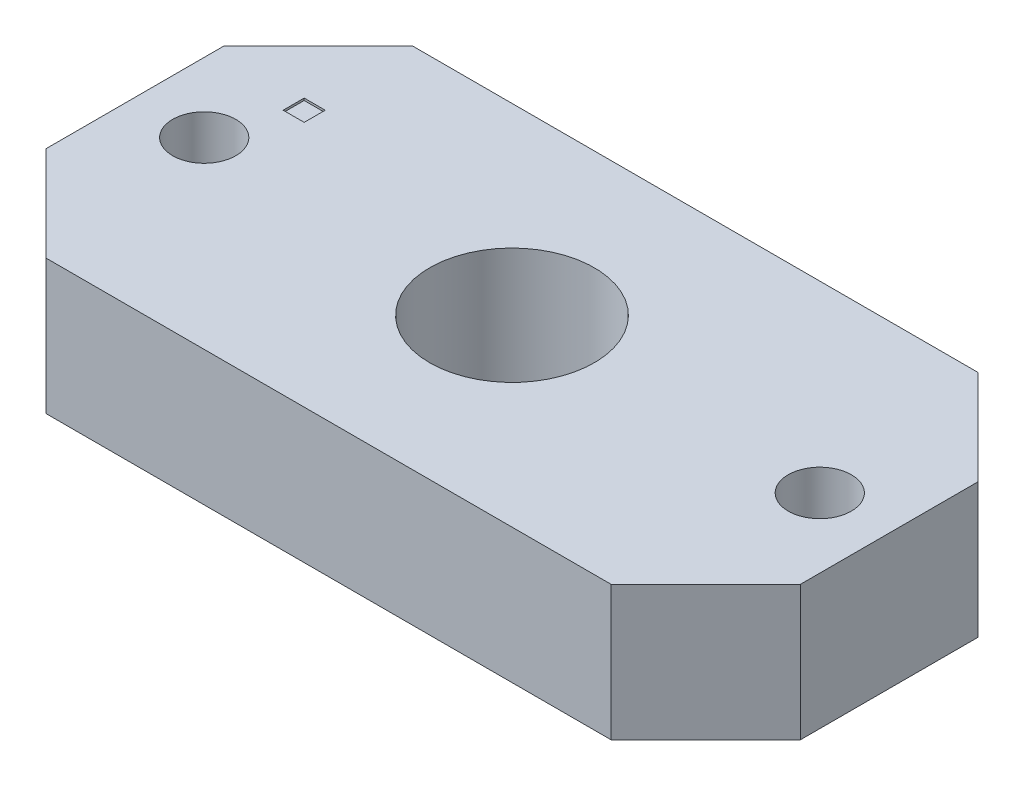
ISO-10303-21;
HEADER;
FILE_DESCRIPTION(('STEP AP214'),'2;1');
FILE_NAME('part.step','',(''),(''),'','','');
FILE_SCHEMA(('AUTOMOTIVE_DESIGN { 1 0 10303 214 1 1 1 1 }'));
ENDSEC;
DATA;
#1=APPLICATION_CONTEXT('core data for automotive mechanical design processes');
#2=APPLICATION_PROTOCOL_DEFINITION('international standard','automotive_design',2000,#1);
#3=PRODUCT_CONTEXT('',#1,'mechanical');
#4=PRODUCT('Part','Part','',(#3));
#5=PRODUCT_RELATED_PRODUCT_CATEGORY('part','',(#4));
#6=PRODUCT_DEFINITION_FORMATION('','',#4);
#7=PRODUCT_DEFINITION_CONTEXT('part definition',#1,'design');
#8=PRODUCT_DEFINITION('design','',#6,#7);
#9=PRODUCT_DEFINITION_SHAPE('','',#8);
#10=(LENGTH_UNIT() NAMED_UNIT(*) SI_UNIT(.MILLI.,.METRE.));
#11=(NAMED_UNIT(*) PLANE_ANGLE_UNIT() SI_UNIT($,.RADIAN.));
#12=(NAMED_UNIT(*) SI_UNIT($,.STERADIAN.) SOLID_ANGLE_UNIT());
#13=UNCERTAINTY_MEASURE_WITH_UNIT(LENGTH_MEASURE(1.E-05),#10,'distance_accuracy_value','');
#14=(GEOMETRIC_REPRESENTATION_CONTEXT(3) GLOBAL_UNCERTAINTY_ASSIGNED_CONTEXT((#13)) GLOBAL_UNIT_ASSIGNED_CONTEXT((#10,
#11,#12)) REPRESENTATION_CONTEXT('',''));
#15=CARTESIAN_POINT('',(0.,0.,0.));
#16=DIRECTION('',(0.,0.,1.));
#17=DIRECTION('',(1.,0.,0.));
#18=AXIS2_PLACEMENT_3D('',#15,#16,#17);
#19=CARTESIAN_POINT('',(106.99610131961,6.4,-15.883489834479));
#20=DIRECTION('',(0.,1.,0.));
#21=DIRECTION('',(0.,0.,1.));
#22=AXIS2_PLACEMENT_3D('',#19,#20,#21);
#23=PLANE('',#22);
#24=DIRECTION('',(0.,0.,-1.));
#25=VECTOR('',#24,1.);
#26=CARTESIAN_POINT('',(76.1960237212015,6.4,-10.1650905944788));
#27=LINE('',#26,#25);
#28=CARTESIAN_POINT('',(76.1960237212015,6.4,-10.1650905944788));
#29=VERTEX_POINT('',#28);
#30=CARTESIAN_POINT('',(76.1960237212015,6.4,-11.1650905944788));
#31=VERTEX_POINT('',#30);
#32=EDGE_CURVE('E47',#29,#31,#27,.T.);
#33=ORIENTED_EDGE('',*,*,#32,.F.);
#34=DIRECTION('',(1.,0.,0.));
#35=VECTOR('',#34,1.);
#36=CARTESIAN_POINT('',(75.1960237212015,6.4,-10.1650905944788));
#37=LINE('',#36,#35);
#38=CARTESIAN_POINT('',(75.1960237212015,6.4,-10.1650905944788));
#39=VERTEX_POINT('',#38);
#40=EDGE_CURVE('E219',#39,#29,#37,.T.);
#41=ORIENTED_EDGE('',*,*,#40,.F.);
#42=DIRECTION('',(0.,0.,1.));
#43=VECTOR('',#42,1.);
#44=CARTESIAN_POINT('',(75.1960237212015,6.4,-10.1650905944788));
#45=LINE('',#44,#43);
#46=CARTESIAN_POINT('',(75.1960237212015,6.4,-11.1650905944788));
#47=VERTEX_POINT('',#46);
#48=EDGE_CURVE('E223',#47,#39,#45,.T.);
#49=ORIENTED_EDGE('',*,*,#48,.F.);
#50=DIRECTION('',(-1.,0.,0.));
#51=VECTOR('',#50,1.);
#52=CARTESIAN_POINT('',(76.1960237212015,6.4,-11.1650905944788));
#53=LINE('',#52,#51);
#54=EDGE_CURVE('E226',#31,#47,#53,.T.);
#55=ORIENTED_EDGE('',*,*,#54,.F.);
#56=EDGE_LOOP('',(#33,#41,#49,#55));
#57=FACE_BOUND('',#56,.T.);
#58=CARTESIAN_POINT('',(74.4461013196099,6.4,-7.16509059447879));
#59=DIRECTION('',(0.,1.,0.));
#60=DIRECTION('',(0.,0.,1.));
#61=AXIS2_PLACEMENT_3D('',#58,#59,#60);
#62=CIRCLE('',#61,1.5);
#63=CARTESIAN_POINT('',(74.4461013196099,6.4,-5.66509059447879));
#64=VERTEX_POINT('',#63);
#65=EDGE_CURVE('E194',#64,#64,#62,.T.);
#66=ORIENTED_EDGE('',*,*,#65,.F.);
#67=EDGE_LOOP('',(#66));
#68=FACE_BOUND('',#67,.T.);
#69=DIRECTION('',(0.,0.,-1.));
#70=VECTOR('',#69,1.);
#71=CARTESIAN_POINT('',(106.99610131961,6.4,-2.94669135447867));
#72=LINE('',#71,#70);
#73=CARTESIAN_POINT('',(106.99610131961,6.4,-2.94669135447867));
#74=VERTEX_POINT('',#73);
#75=CARTESIAN_POINT('',(106.99610131961,6.4,-11.3834898344789));
#76=VERTEX_POINT('',#75);
#77=EDGE_CURVE('E157',#74,#76,#72,.T.);
#78=ORIENTED_EDGE('',*,*,#77,.T.);
#79=DIRECTION('',(-0.707106781186541,0.,-0.707106781186554));
#80=VECTOR('',#79,1.);
#81=CARTESIAN_POINT('',(102.49610131961,6.4,-15.8834898344789));
#82=LINE('',#81,#80);
#83=CARTESIAN_POINT('',(102.49610131961,6.4,-15.8834898344789));
#84=VERTEX_POINT('',#83);
#85=EDGE_CURVE('E97',#76,#84,#82,.T.);
#86=ORIENTED_EDGE('',*,*,#85,.T.);
#87=DIRECTION('',(-1.,0.,0.));
#88=VECTOR('',#87,1.);
#89=CARTESIAN_POINT('',(102.49610131961,6.4,-15.8834898344789));
#90=LINE('',#89,#88);
#91=CARTESIAN_POINT('',(75.6461013196099,6.4,-15.8834898344788));
#92=VERTEX_POINT('',#91);
#93=EDGE_CURVE('E172',#84,#92,#90,.T.);
#94=ORIENTED_EDGE('',*,*,#93,.T.);
#95=DIRECTION('',(-0.707106781186544,0.,0.707106781186551));
#96=VECTOR('',#95,1.);
#97=CARTESIAN_POINT('',(75.6461013196099,6.4,-15.8834898344788));
#98=LINE('',#97,#96);
#99=CARTESIAN_POINT('',(71.1461013196099,6.4,-11.3834898344788));
#100=VERTEX_POINT('',#99);
#101=EDGE_CURVE('E185',#92,#100,#98,.T.);
#102=ORIENTED_EDGE('',*,*,#101,.T.);
#103=DIRECTION('',(0.,0.,1.));
#104=VECTOR('',#103,1.);
#105=CARTESIAN_POINT('',(71.1461013196099,6.4,-2.94669135447882));
#106=LINE('',#105,#104);
#107=CARTESIAN_POINT('',(71.1461013196099,6.4,-2.94669135447882));
#108=VERTEX_POINT('',#107);
#109=EDGE_CURVE('E120',#100,#108,#106,.T.);
#110=ORIENTED_EDGE('',*,*,#109,.T.);
#111=DIRECTION('',(0.707106781186548,0.,0.707106781186548));
#112=VECTOR('',#111,1.);
#113=CARTESIAN_POINT('',(75.6461013196099,6.4,1.55330864552121));
#114=LINE('',#113,#112);
#115=CARTESIAN_POINT('',(75.6461013196099,6.4,1.55330864552121));
#116=VERTEX_POINT('',#115);
#117=EDGE_CURVE('E113',#108,#116,#114,.T.);
#118=ORIENTED_EDGE('',*,*,#117,.T.);
#119=DIRECTION('',(1.,0.,0.));
#120=VECTOR('',#119,1.);
#121=CARTESIAN_POINT('',(102.49610131961,6.4,1.55330864552121));
#122=LINE('',#121,#120);
#123=CARTESIAN_POINT('',(102.49610131961,6.4,1.55330864552121));
#124=VERTEX_POINT('',#123);
#125=EDGE_CURVE('E117',#116,#124,#122,.T.);
#126=ORIENTED_EDGE('',*,*,#125,.T.);
#127=DIRECTION('',(0.707106781186547,0.,-0.707106781186547));
#128=VECTOR('',#127,1.);
#129=CARTESIAN_POINT('',(102.49610131961,6.4,1.55330864552121));
#130=LINE('',#129,#128);
#131=EDGE_CURVE('E56',#124,#74,#130,.T.);
#132=ORIENTED_EDGE('',*,*,#131,.T.);
#133=EDGE_LOOP('',(#78,#86,#94,#102,#110,#118,#126,#132));
#134=FACE_BOUND('',#133,.T.);
#135=CARTESIAN_POINT('',(89.0711013196099,6.4,-7.16509059447879));
#136=DIRECTION('',(0.,1.,0.));
#137=DIRECTION('',(0.,0.,1.));
#138=AXIS2_PLACEMENT_3D('',#135,#136,#137);
#139=CIRCLE('',#138,3.9125);
#140=CARTESIAN_POINT('',(89.0711013196099,6.4,-3.25259059447878));
#141=VERTEX_POINT('',#140);
#142=EDGE_CURVE('E145',#141,#141,#139,.T.);
#143=ORIENTED_EDGE('',*,*,#142,.F.);
#144=EDGE_LOOP('',(#143));
#145=FACE_BOUND('',#144,.T.);
#146=CARTESIAN_POINT('',(103.69610131961,6.4,-7.16509059447886));
#147=DIRECTION('',(0.,1.,0.));
#148=DIRECTION('',(0.,0.,-1.));
#149=AXIS2_PLACEMENT_3D('',#146,#147,#148);
#150=CIRCLE('',#149,1.5);
#151=CARTESIAN_POINT('',(103.69610131961,6.4,-8.66509059447886));
#152=VERTEX_POINT('',#151);
#153=EDGE_CURVE('E200',#152,#152,#150,.T.);
#154=ORIENTED_EDGE('',*,*,#153,.F.);
#155=EDGE_LOOP('',(#154));
#156=FACE_BOUND('',#155,.T.);
#157=ADVANCED_FACE('F32',(#57,#68,#134,#145,#156),#23,.T.);
#158=CARTESIAN_POINT('',(106.99610131961,0.,-15.883489834479));
#159=DIRECTION('',(0.,1.,0.));
#160=DIRECTION('',(0.,0.,1.));
#161=AXIS2_PLACEMENT_3D('',#158,#159,#160);
#162=PLANE('',#161);
#163=CARTESIAN_POINT('',(74.4461013196099,0.,-7.16509059447879));
#164=DIRECTION('',(0.,1.,0.));
#165=DIRECTION('',(0.,0.,1.));
#166=AXIS2_PLACEMENT_3D('',#163,#164,#165);
#167=CIRCLE('',#166,1.5);
#168=CARTESIAN_POINT('',(74.4461013196099,0.,-5.66509059447879));
#169=VERTEX_POINT('',#168);
#170=EDGE_CURVE('E197',#169,#169,#167,.T.);
#171=ORIENTED_EDGE('',*,*,#170,.T.);
#172=EDGE_LOOP('',(#171));
#173=FACE_BOUND('',#172,.T.);
#174=DIRECTION('',(0.,0.,-1.));
#175=VECTOR('',#174,1.);
#176=CARTESIAN_POINT('',(106.99610131961,0.,-2.94669135447867));
#177=LINE('',#176,#175);
#178=CARTESIAN_POINT('',(106.99610131961,0.,-2.94669135447867));
#179=VERTEX_POINT('',#178);
#180=CARTESIAN_POINT('',(106.99610131961,0.,-11.3834898344789));
#181=VERTEX_POINT('',#180);
#182=EDGE_CURVE('E141',#179,#181,#177,.T.);
#183=ORIENTED_EDGE('',*,*,#182,.F.);
#184=DIRECTION('',(0.707106781186547,0.,-0.707106781186547));
#185=VECTOR('',#184,1.);
#186=CARTESIAN_POINT('',(102.49610131961,0.,1.55330864552121));
#187=LINE('',#186,#185);
#188=CARTESIAN_POINT('',(102.49610131961,0.,1.55330864552121));
#189=VERTEX_POINT('',#188);
#190=EDGE_CURVE('E89',#189,#179,#187,.T.);
#191=ORIENTED_EDGE('',*,*,#190,.F.);
#192=DIRECTION('',(1.,0.,0.));
#193=VECTOR('',#192,1.);
#194=CARTESIAN_POINT('',(102.49610131961,0.,1.55330864552121));
#195=LINE('',#194,#193);
#196=CARTESIAN_POINT('',(75.6461013196099,0.,1.55330864552121));
#197=VERTEX_POINT('',#196);
#198=EDGE_CURVE('E154',#197,#189,#195,.T.);
#199=ORIENTED_EDGE('',*,*,#198,.F.);
#200=DIRECTION('',(0.707106781186548,0.,0.707106781186548));
#201=VECTOR('',#200,1.);
#202=CARTESIAN_POINT('',(75.6461013196099,0.,1.55330864552121));
#203=LINE('',#202,#201);
#204=CARTESIAN_POINT('',(71.1461013196099,0.,-2.94669135447882));
#205=VERTEX_POINT('',#204);
#206=EDGE_CURVE('E129',#205,#197,#203,.T.);
#207=ORIENTED_EDGE('',*,*,#206,.F.);
#208=DIRECTION('',(0.,0.,1.));
#209=VECTOR('',#208,1.);
#210=CARTESIAN_POINT('',(71.1461013196099,0.,-2.94669135447882));
#211=LINE('',#210,#209);
#212=CARTESIAN_POINT('',(71.1461013196099,0.,-11.3834898344788));
#213=VERTEX_POINT('',#212);
#214=EDGE_CURVE('E151',#213,#205,#211,.T.);
#215=ORIENTED_EDGE('',*,*,#214,.F.);
#216=DIRECTION('',(-0.707106781186544,0.,0.707106781186551));
#217=VECTOR('',#216,1.);
#218=CARTESIAN_POINT('',(75.6461013196099,0.,-15.8834898344788));
#219=LINE('',#218,#217);
#220=CARTESIAN_POINT('',(75.6461013196099,0.,-15.8834898344788));
#221=VERTEX_POINT('',#220);
#222=EDGE_CURVE('E149',#221,#213,#219,.T.);
#223=ORIENTED_EDGE('',*,*,#222,.F.);
#224=DIRECTION('',(-1.,0.,0.));
#225=VECTOR('',#224,1.);
#226=CARTESIAN_POINT('',(102.49610131961,0.,-15.8834898344789));
#227=LINE('',#226,#225);
#228=CARTESIAN_POINT('',(102.49610131961,0.,-15.8834898344789));
#229=VERTEX_POINT('',#228);
#230=EDGE_CURVE('E147',#229,#221,#227,.T.);
#231=ORIENTED_EDGE('',*,*,#230,.F.);
#232=DIRECTION('',(-0.707106781186541,0.,-0.707106781186554));
#233=VECTOR('',#232,1.);
#234=CARTESIAN_POINT('',(102.49610131961,0.,-15.8834898344789));
#235=LINE('',#234,#233);
#236=EDGE_CURVE('E144',#181,#229,#235,.T.);
#237=ORIENTED_EDGE('',*,*,#236,.F.);
#238=EDGE_LOOP('',(#183,#191,#199,#207,#215,#223,#231,#237));
#239=FACE_BOUND('',#238,.T.);
#240=CARTESIAN_POINT('',(89.0711013196099,0.,-7.16509059447879));
#241=DIRECTION('',(0.,1.,0.));
#242=DIRECTION('',(0.,0.,1.));
#243=AXIS2_PLACEMENT_3D('',#240,#241,#242);
#244=CIRCLE('',#243,3.9125);
#245=CARTESIAN_POINT('',(89.0711013196099,0.,-3.25259059447878));
#246=VERTEX_POINT('',#245);
#247=EDGE_CURVE('E191',#246,#246,#244,.T.);
#248=ORIENTED_EDGE('',*,*,#247,.T.);
#249=EDGE_LOOP('',(#248));
#250=FACE_BOUND('',#249,.T.);
#251=CARTESIAN_POINT('',(103.69610131961,0.,-7.16509059447886));
#252=DIRECTION('',(0.,1.,0.));
#253=DIRECTION('',(0.,0.,-1.));
#254=AXIS2_PLACEMENT_3D('',#251,#252,#253);
#255=CIRCLE('',#254,1.5);
#256=CARTESIAN_POINT('',(103.69610131961,0.,-8.66509059447886));
#257=VERTEX_POINT('',#256);
#258=EDGE_CURVE('E203',#257,#257,#255,.T.);
#259=ORIENTED_EDGE('',*,*,#258,.T.);
#260=EDGE_LOOP('',(#259));
#261=FACE_BOUND('',#260,.T.);
#262=ADVANCED_FACE('F176',(#173,#239,#250,#261),#162,.F.);
#263=CARTESIAN_POINT('',(106.99610131961,6.4,-2.94669135447867));
#264=DIRECTION('',(-1.,0.,0.));
#265=DIRECTION('',(0.,0.,1.));
#266=AXIS2_PLACEMENT_3D('',#263,#264,#265);
#267=PLANE('',#266);
#268=ORIENTED_EDGE('',*,*,#182,.T.);
#269=DIRECTION('',(0.,-1.,0.));
#270=VECTOR('',#269,1.);
#271=CARTESIAN_POINT('',(106.99610131961,6.4,-11.3834898344789));
#272=LINE('',#271,#270);
#273=EDGE_CURVE('E11',#76,#181,#272,.T.);
#274=ORIENTED_EDGE('',*,*,#273,.F.);
#275=ORIENTED_EDGE('',*,*,#77,.F.);
#276=DIRECTION('',(0.,-1.,0.));
#277=VECTOR('',#276,1.);
#278=CARTESIAN_POINT('',(106.99610131961,6.4,-2.94669135447867));
#279=LINE('',#278,#277);
#280=EDGE_CURVE('E137',#74,#179,#279,.T.);
#281=ORIENTED_EDGE('',*,*,#280,.T.);
#282=EDGE_LOOP('',(#268,#274,#275,#281));
#283=FACE_BOUND('',#282,.T.);
#284=ADVANCED_FACE('F34',(#283),#267,.F.);
#285=CARTESIAN_POINT('',(102.49610131961,6.4,-15.8834898344789));
#286=DIRECTION('',(-0.707106781186554,0.,0.707106781186541));
#287=DIRECTION('',(0.707106781186541,0.,0.707106781186554));
#288=AXIS2_PLACEMENT_3D('',#285,#286,#287);
#289=PLANE('',#288);
#290=ORIENTED_EDGE('',*,*,#236,.T.);
#291=DIRECTION('',(0.,-1.,0.));
#292=VECTOR('',#291,1.);
#293=CARTESIAN_POINT('',(102.49610131961,6.4,-15.8834898344789));
#294=LINE('',#293,#292);
#295=EDGE_CURVE('E40',#84,#229,#294,.T.);
#296=ORIENTED_EDGE('',*,*,#295,.F.);
#297=ORIENTED_EDGE('',*,*,#85,.F.);
#298=ORIENTED_EDGE('',*,*,#273,.T.);
#299=EDGE_LOOP('',(#290,#296,#297,#298));
#300=FACE_BOUND('',#299,.T.);
#301=ADVANCED_FACE('F302',(#300),#289,.F.);
#302=CARTESIAN_POINT('',(102.49610131961,6.4,-15.8834898344789));
#303=DIRECTION('',(0.,0.,1.));
#304=DIRECTION('',(1.,0.,0.));
#305=AXIS2_PLACEMENT_3D('',#302,#303,#304);
#306=PLANE('',#305);
#307=ORIENTED_EDGE('',*,*,#230,.T.);
#308=DIRECTION('',(0.,-1.,0.));
#309=VECTOR('',#308,1.);
#310=CARTESIAN_POINT('',(75.6461013196099,6.4,-15.8834898344788));
#311=LINE('',#310,#309);
#312=EDGE_CURVE('E164',#92,#221,#311,.T.);
#313=ORIENTED_EDGE('',*,*,#312,.F.);
#314=ORIENTED_EDGE('',*,*,#93,.F.);
#315=ORIENTED_EDGE('',*,*,#295,.T.);
#316=EDGE_LOOP('',(#307,#313,#314,#315));
#317=FACE_BOUND('',#316,.T.);
#318=ADVANCED_FACE('F170',(#317),#306,.F.);
#319=CARTESIAN_POINT('',(75.6461013196099,6.4,-15.8834898344788));
#320=DIRECTION('',(0.707106781186551,0.,0.707106781186544));
#321=DIRECTION('',(0.707106781186544,0.,-0.707106781186551));
#322=AXIS2_PLACEMENT_3D('',#319,#320,#321);
#323=PLANE('',#322);
#324=ORIENTED_EDGE('',*,*,#222,.T.);
#325=DIRECTION('',(0.,-1.,0.));
#326=VECTOR('',#325,1.);
#327=CARTESIAN_POINT('',(71.1461013196099,6.4,-11.3834898344788));
#328=LINE('',#327,#326);
#329=EDGE_CURVE('E161',#100,#213,#328,.T.);
#330=ORIENTED_EDGE('',*,*,#329,.F.);
#331=ORIENTED_EDGE('',*,*,#101,.F.);
#332=ORIENTED_EDGE('',*,*,#312,.T.);
#333=EDGE_LOOP('',(#324,#330,#331,#332));
#334=FACE_BOUND('',#333,.T.);
#335=ADVANCED_FACE('F181',(#334),#323,.F.);
#336=CARTESIAN_POINT('',(71.1461013196099,6.4,-2.94669135447882));
#337=DIRECTION('',(1.,0.,0.));
#338=DIRECTION('',(0.,0.,-1.));
#339=AXIS2_PLACEMENT_3D('',#336,#337,#338);
#340=PLANE('',#339);
#341=ORIENTED_EDGE('',*,*,#214,.T.);
#342=DIRECTION('',(0.,-1.,0.));
#343=VECTOR('',#342,1.);
#344=CARTESIAN_POINT('',(71.1461013196099,6.4,-2.94669135447882));
#345=LINE('',#344,#343);
#346=EDGE_CURVE('E132',#108,#205,#345,.T.);
#347=ORIENTED_EDGE('',*,*,#346,.F.);
#348=ORIENTED_EDGE('',*,*,#109,.F.);
#349=ORIENTED_EDGE('',*,*,#329,.T.);
#350=EDGE_LOOP('',(#341,#347,#348,#349));
#351=FACE_BOUND('',#350,.T.);
#352=ADVANCED_FACE('F184',(#351),#340,.F.);
#353=CARTESIAN_POINT('',(75.6461013196099,6.4,1.55330864552121));
#354=DIRECTION('',(0.707106781186548,0.,-0.707106781186548));
#355=DIRECTION('',(-0.707106781186548,0.,-0.707106781186548));
#356=AXIS2_PLACEMENT_3D('',#353,#354,#355);
#357=PLANE('',#356);
#358=ORIENTED_EDGE('',*,*,#206,.T.);
#359=DIRECTION('',(0.,-1.,0.));
#360=VECTOR('',#359,1.);
#361=CARTESIAN_POINT('',(75.6461013196099,6.4,1.55330864552121));
#362=LINE('',#361,#360);
#363=EDGE_CURVE('E126',#116,#197,#362,.T.);
#364=ORIENTED_EDGE('',*,*,#363,.F.);
#365=ORIENTED_EDGE('',*,*,#117,.F.);
#366=ORIENTED_EDGE('',*,*,#346,.T.);
#367=EDGE_LOOP('',(#358,#364,#365,#366));
#368=FACE_BOUND('',#367,.T.);
#369=ADVANCED_FACE('F127',(#368),#357,.F.);
#370=CARTESIAN_POINT('',(102.49610131961,6.4,1.55330864552121));
#371=DIRECTION('',(0.,0.,-1.));
#372=DIRECTION('',(-1.,0.,0.));
#373=AXIS2_PLACEMENT_3D('',#370,#371,#372);
#374=PLANE('',#373);
#375=ORIENTED_EDGE('',*,*,#198,.T.);
#376=DIRECTION('',(0.,-1.,0.));
#377=VECTOR('',#376,1.);
#378=CARTESIAN_POINT('',(102.49610131961,6.4,1.55330864552121));
#379=LINE('',#378,#377);
#380=EDGE_CURVE('E133',#124,#189,#379,.T.);
#381=ORIENTED_EDGE('',*,*,#380,.F.);
#382=ORIENTED_EDGE('',*,*,#125,.F.);
#383=ORIENTED_EDGE('',*,*,#363,.T.);
#384=EDGE_LOOP('',(#375,#381,#382,#383));
#385=FACE_BOUND('',#384,.T.);
#386=ADVANCED_FACE('F135',(#385),#374,.F.);
#387=CARTESIAN_POINT('',(102.49610131961,6.4,1.55330864552121));
#388=DIRECTION('',(-0.707106781186548,0.,-0.707106781186547));
#389=DIRECTION('',(-0.707106781186547,0.,0.707106781186548));
#390=AXIS2_PLACEMENT_3D('',#387,#388,#389);
#391=PLANE('',#390);
#392=ORIENTED_EDGE('',*,*,#190,.T.);
#393=ORIENTED_EDGE('',*,*,#280,.F.);
#394=ORIENTED_EDGE('',*,*,#131,.F.);
#395=ORIENTED_EDGE('',*,*,#380,.T.);
#396=EDGE_LOOP('',(#392,#393,#394,#395));
#397=FACE_BOUND('',#396,.T.);
#398=ADVANCED_FACE('F290',(#397),#391,.F.);
#399=CARTESIAN_POINT('',(89.0711013196099,6.4,-7.16509059447879));
#400=DIRECTION('',(0.,-1.,0.));
#401=DIRECTION('',(0.,0.,-1.));
#402=AXIS2_PLACEMENT_3D('',#399,#400,#401);
#403=CYLINDRICAL_SURFACE('',#402,3.9125);
#404=ORIENTED_EDGE('',*,*,#142,.T.);
#405=EDGE_LOOP('',(#404));
#406=FACE_BOUND('',#405,.T.);
#407=ORIENTED_EDGE('',*,*,#247,.F.);
#408=EDGE_LOOP('',(#407));
#409=FACE_BOUND('',#408,.T.);
#410=ADVANCED_FACE('F287',(#406,#409),#403,.F.);
#411=CARTESIAN_POINT('',(74.4461013196099,6.4,-7.16509059447879));
#412=DIRECTION('',(0.,-1.,0.));
#413=DIRECTION('',(0.,0.,-1.));
#414=AXIS2_PLACEMENT_3D('',#411,#412,#413);
#415=CYLINDRICAL_SURFACE('',#414,1.5);
#416=ORIENTED_EDGE('',*,*,#65,.T.);
#417=EDGE_LOOP('',(#416));
#418=FACE_BOUND('',#417,.T.);
#419=ORIENTED_EDGE('',*,*,#170,.F.);
#420=EDGE_LOOP('',(#419));
#421=FACE_BOUND('',#420,.T.);
#422=ADVANCED_FACE('F365',(#418,#421),#415,.F.);
#423=CARTESIAN_POINT('',(103.69610131961,6.4,-7.16509059447886));
#424=DIRECTION('',(0.,-1.,0.));
#425=DIRECTION('',(0.,0.,-1.));
#426=AXIS2_PLACEMENT_3D('',#423,#424,#425);
#427=CYLINDRICAL_SURFACE('',#426,1.5);
#428=ORIENTED_EDGE('',*,*,#153,.T.);
#429=EDGE_LOOP('',(#428));
#430=FACE_BOUND('',#429,.T.);
#431=ORIENTED_EDGE('',*,*,#258,.F.);
#432=EDGE_LOOP('',(#431));
#433=FACE_BOUND('',#432,.T.);
#434=ADVANCED_FACE('F373',(#430,#433),#427,.F.);
#435=CARTESIAN_POINT('',(76.1960237212015,6.3,-10.1650905944788));
#436=DIRECTION('',(1.,0.,0.));
#437=DIRECTION('',(0.,0.,-1.));
#438=AXIS2_PLACEMENT_3D('',#435,#436,#437);
#439=PLANE('',#438);
#440=ORIENTED_EDGE('',*,*,#32,.T.);
#441=DIRECTION('',(0.,1.,0.));
#442=VECTOR('',#441,1.);
#443=CARTESIAN_POINT('',(76.1960237212015,6.3,-11.1650905944788));
#444=LINE('',#443,#442);
#445=CARTESIAN_POINT('',(76.1960237212015,6.3,-11.1650905944788));
#446=VERTEX_POINT('',#445);
#447=EDGE_CURVE('E209',#446,#31,#444,.T.);
#448=ORIENTED_EDGE('',*,*,#447,.F.);
#449=DIRECTION('',(0.,0.,-1.));
#450=VECTOR('',#449,1.);
#451=CARTESIAN_POINT('',(76.1960237212015,6.3,-10.1650905944788));
#452=LINE('',#451,#450);
#453=CARTESIAN_POINT('',(76.1960237212015,6.3,-10.1650905944788));
#454=VERTEX_POINT('',#453);
#455=EDGE_CURVE('E222',#454,#446,#452,.T.);
#456=ORIENTED_EDGE('',*,*,#455,.F.);
#457=DIRECTION('',(0.,1.,0.));
#458=VECTOR('',#457,1.);
#459=CARTESIAN_POINT('',(76.1960237212015,6.3,-10.1650905944788));
#460=LINE('',#459,#458);
#461=EDGE_CURVE('E206',#454,#29,#460,.T.);
#462=ORIENTED_EDGE('',*,*,#461,.T.);
#463=EDGE_LOOP('',(#440,#448,#456,#462));
#464=FACE_BOUND('',#463,.T.);
#465=ADVANCED_FACE('F247',(#464),#439,.F.);
#466=CARTESIAN_POINT('',(75.1960237212015,6.3,-10.1650905944788));
#467=DIRECTION('',(0.,0.,1.));
#468=DIRECTION('',(1.,0.,0.));
#469=AXIS2_PLACEMENT_3D('',#466,#467,#468);
#470=PLANE('',#469);
#471=ORIENTED_EDGE('',*,*,#40,.T.);
#472=ORIENTED_EDGE('',*,*,#461,.F.);
#473=DIRECTION('',(1.,0.,0.));
#474=VECTOR('',#473,1.);
#475=CARTESIAN_POINT('',(75.1960237212015,6.3,-10.1650905944788));
#476=LINE('',#475,#474);
#477=CARTESIAN_POINT('',(75.1960237212015,6.3,-10.1650905944788));
#478=VERTEX_POINT('',#477);
#479=EDGE_CURVE('E212',#478,#454,#476,.T.);
#480=ORIENTED_EDGE('',*,*,#479,.F.);
#481=DIRECTION('',(0.,1.,0.));
#482=VECTOR('',#481,1.);
#483=CARTESIAN_POINT('',(75.1960237212015,6.3,-10.1650905944788));
#484=LINE('',#483,#482);
#485=EDGE_CURVE('E215',#478,#39,#484,.T.);
#486=ORIENTED_EDGE('',*,*,#485,.T.);
#487=EDGE_LOOP('',(#471,#472,#480,#486));
#488=FACE_BOUND('',#487,.T.);
#489=ADVANCED_FACE('F258',(#488),#470,.F.);
#490=CARTESIAN_POINT('',(75.1960237212015,6.3,-10.1650905944788));
#491=DIRECTION('',(-1.,0.,0.));
#492=DIRECTION('',(0.,0.,1.));
#493=AXIS2_PLACEMENT_3D('',#490,#491,#492);
#494=PLANE('',#493);
#495=ORIENTED_EDGE('',*,*,#48,.T.);
#496=ORIENTED_EDGE('',*,*,#485,.F.);
#497=DIRECTION('',(0.,0.,1.));
#498=VECTOR('',#497,1.);
#499=CARTESIAN_POINT('',(75.1960237212015,6.3,-10.1650905944788));
#500=LINE('',#499,#498);
#501=CARTESIAN_POINT('',(75.1960237212015,6.3,-11.1650905944788));
#502=VERTEX_POINT('',#501);
#503=EDGE_CURVE('E232',#502,#478,#500,.T.);
#504=ORIENTED_EDGE('',*,*,#503,.F.);
#505=DIRECTION('',(0.,1.,0.));
#506=VECTOR('',#505,1.);
#507=CARTESIAN_POINT('',(75.1960237212015,6.3,-11.1650905944788));
#508=LINE('',#507,#506);
#509=EDGE_CURVE('E211',#502,#47,#508,.T.);
#510=ORIENTED_EDGE('',*,*,#509,.T.);
#511=EDGE_LOOP('',(#495,#496,#504,#510));
#512=FACE_BOUND('',#511,.T.);
#513=ADVANCED_FACE('F263',(#512),#494,.F.);
#514=CARTESIAN_POINT('',(76.1960237212015,6.3,-11.1650905944788));
#515=DIRECTION('',(0.,0.,-1.));
#516=DIRECTION('',(-1.,0.,0.));
#517=AXIS2_PLACEMENT_3D('',#514,#515,#516);
#518=PLANE('',#517);
#519=ORIENTED_EDGE('',*,*,#54,.T.);
#520=ORIENTED_EDGE('',*,*,#509,.F.);
#521=DIRECTION('',(-1.,0.,0.));
#522=VECTOR('',#521,1.);
#523=CARTESIAN_POINT('',(76.1960237212015,6.3,-11.1650905944788));
#524=LINE('',#523,#522);
#525=EDGE_CURVE('E235',#446,#502,#524,.T.);
#526=ORIENTED_EDGE('',*,*,#525,.F.);
#527=ORIENTED_EDGE('',*,*,#447,.T.);
#528=EDGE_LOOP('',(#519,#520,#526,#527));
#529=FACE_BOUND('',#528,.T.);
#530=ADVANCED_FACE('F269',(#529),#518,.F.);
#531=CARTESIAN_POINT('',(76.1960237212015,6.3,-11.1650905944788));
#532=DIRECTION('',(0.,1.,0.));
#533=DIRECTION('',(0.,0.,1.));
#534=AXIS2_PLACEMENT_3D('',#531,#532,#533);
#535=PLANE('',#534);
#536=ORIENTED_EDGE('',*,*,#455,.T.);
#537=ORIENTED_EDGE('',*,*,#525,.T.);
#538=ORIENTED_EDGE('',*,*,#503,.T.);
#539=ORIENTED_EDGE('',*,*,#479,.T.);
#540=EDGE_LOOP('',(#536,#537,#538,#539));
#541=FACE_BOUND('',#540,.T.);
#542=ADVANCED_FACE('F242',(#541),#535,.T.);
#543=CLOSED_SHELL('',(#157,#262,#284,#301,#318,#335,#352,#369,#386,#398,#410,#422,#434,#465,
#489,#513,#530,#542));
#544=MANIFOLD_SOLID_BREP('B2',#543);
#545=ADVANCED_BREP_SHAPE_REPRESENTATION('',(#18,#544),#14);
#546=SHAPE_DEFINITION_REPRESENTATION(#9,#545);
ENDSEC;
END-ISO-10303-21;
